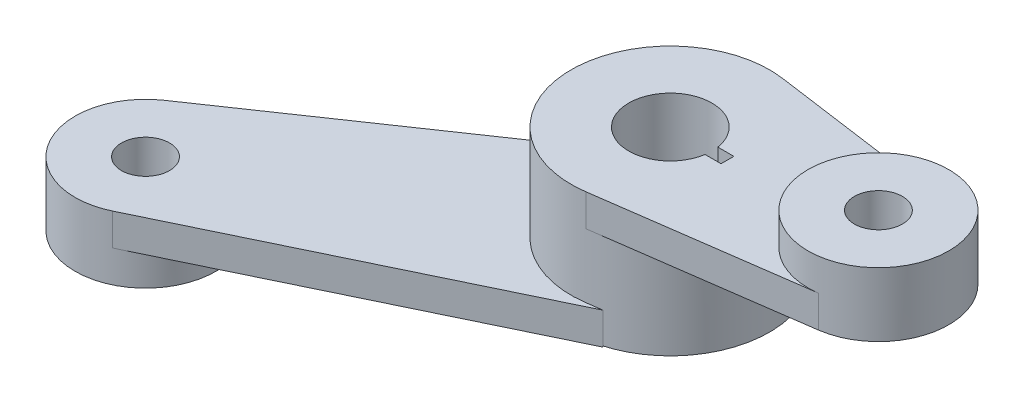
ISO-10303-21;
HEADER;
FILE_DESCRIPTION(('STEP AP214'),'2;1');
FILE_NAME('part.step','',(''),(''),'','','');
FILE_SCHEMA(('AUTOMOTIVE_DESIGN { 1 0 10303 214 1 1 1 1 }'));
ENDSEC;
DATA;
#1=APPLICATION_CONTEXT('core data for automotive mechanical design processes');
#2=APPLICATION_PROTOCOL_DEFINITION('international standard','automotive_design',2000,#1);
#3=PRODUCT_CONTEXT('',#1,'mechanical');
#4=PRODUCT('Part','Part','',(#3));
#5=PRODUCT_RELATED_PRODUCT_CATEGORY('part','',(#4));
#6=PRODUCT_DEFINITION_FORMATION('','',#4);
#7=PRODUCT_DEFINITION_CONTEXT('part definition',#1,'design');
#8=PRODUCT_DEFINITION('design','',#6,#7);
#9=PRODUCT_DEFINITION_SHAPE('','',#8);
#10=(LENGTH_UNIT() NAMED_UNIT(*) SI_UNIT(.MILLI.,.METRE.));
#11=(NAMED_UNIT(*) PLANE_ANGLE_UNIT() SI_UNIT($,.RADIAN.));
#12=(NAMED_UNIT(*) SI_UNIT($,.STERADIAN.) SOLID_ANGLE_UNIT());
#13=UNCERTAINTY_MEASURE_WITH_UNIT(LENGTH_MEASURE(1.E-05),#10,'distance_accuracy_value','');
#14=(GEOMETRIC_REPRESENTATION_CONTEXT(3) GLOBAL_UNCERTAINTY_ASSIGNED_CONTEXT((#13)) GLOBAL_UNIT_ASSIGNED_CONTEXT((#10,
#11,#12)) REPRESENTATION_CONTEXT('',''));
#15=CARTESIAN_POINT('',(0.,0.,0.));
#16=DIRECTION('',(0.,0.,1.));
#17=DIRECTION('',(1.,0.,0.));
#18=AXIS2_PLACEMENT_3D('',#15,#16,#17);
#19=CARTESIAN_POINT('',(0.,40.,0.));
#20=DIRECTION('',(0.,-1.,0.));
#21=DIRECTION('',(0.,0.,-1.));
#22=AXIS2_PLACEMENT_3D('',#19,#20,#21);
#23=CYLINDRICAL_SURFACE('',#22,31.);
#24=DIRECTION('',(0.,-1.,0.));
#25=VECTOR('',#24,1.);
#26=CARTESIAN_POINT('',(4.29230769230769,40.,30.7014021613762));
#27=LINE('',#26,#25);
#28=CARTESIAN_POINT('',(4.29230769230769,40.,30.7014021613762));
#29=VERTEX_POINT('',#28);
#30=CARTESIAN_POINT('',(4.29230769230769,30.,30.7014021613762));
#31=VERTEX_POINT('',#30);
#32=EDGE_CURVE('E212',#29,#31,#27,.T.);
#33=ORIENTED_EDGE('',*,*,#32,.F.);
#34=CARTESIAN_POINT('',(0.,40.,0.));
#35=DIRECTION('',(0.,1.,0.));
#36=DIRECTION('',(0.,0.,1.));
#37=AXIS2_PLACEMENT_3D('',#34,#35,#36);
#38=CIRCLE('',#37,31.);
#39=CARTESIAN_POINT('',(4.29230769230769,40.,-30.7014021613762));
#40=VERTEX_POINT('',#39);
#41=EDGE_CURVE('E231',#40,#29,#38,.T.);
#42=ORIENTED_EDGE('',*,*,#41,.F.);
#43=DIRECTION('',(0.,-1.,0.));
#44=VECTOR('',#43,1.);
#45=CARTESIAN_POINT('',(4.29230769230769,40.,-30.7014021613762));
#46=LINE('',#45,#44);
#47=CARTESIAN_POINT('',(4.29230769230769,30.,-30.7014021613762));
#48=VERTEX_POINT('',#47);
#49=EDGE_CURVE('E216',#40,#48,#46,.T.);
#50=ORIENTED_EDGE('',*,*,#49,.T.);
#51=CARTESIAN_POINT('',(0.,30.,0.));
#52=DIRECTION('',(0.,1.,0.));
#53=DIRECTION('',(0.,0.,1.));
#54=AXIS2_PLACEMENT_3D('',#51,#52,#53);
#55=CIRCLE('',#54,31.);
#56=EDGE_CURVE('E63',#31,#48,#55,.T.);
#57=ORIENTED_EDGE('',*,*,#56,.F.);
#58=EDGE_LOOP('',(#33,#42,#50,#57));
#59=FACE_BOUND('',#58,.T.);
#60=DIRECTION('',(0.,-1.,0.));
#61=VECTOR('',#60,1.);
#62=CARTESIAN_POINT('',(-17.4698538370627,10.,-25.6086744465946));
#63=LINE('',#62,#61);
#64=CARTESIAN_POINT('',(-17.4698538370627,10.,-25.6086744465946));
#65=VERTEX_POINT('',#64);
#66=CARTESIAN_POINT('',(-17.4698538370627,0.,-25.6086744465946));
#67=VERTEX_POINT('',#66);
#68=EDGE_CURVE('E178',#65,#67,#63,.T.);
#69=ORIENTED_EDGE('',*,*,#68,.F.);
#70=CARTESIAN_POINT('',(0.,10.,0.));
#71=DIRECTION('',(0.,1.,0.));
#72=DIRECTION('',(0.,0.,1.));
#73=AXIS2_PLACEMENT_3D('',#70,#71,#72);
#74=CIRCLE('',#73,31.);
#75=CARTESIAN_POINT('',(4.29230769230769,10.,30.7014021613762));
#76=VERTEX_POINT('',#75);
#77=EDGE_CURVE('E161',#65,#76,#74,.T.);
#78=ORIENTED_EDGE('',*,*,#77,.T.);
#79=DIRECTION('',(0.,-1.,0.));
#80=VECTOR('',#79,1.);
#81=CARTESIAN_POINT('',(4.29230769230769,10.,30.7014021613762));
#82=LINE('',#81,#80);
#83=CARTESIAN_POINT('',(4.29230769230769,0.,30.7014021613762));
#84=VERTEX_POINT('',#83);
#85=EDGE_CURVE('E182',#76,#84,#82,.T.);
#86=ORIENTED_EDGE('',*,*,#85,.T.);
#87=CARTESIAN_POINT('',(0.,0.,0.));
#88=DIRECTION('',(0.,1.,0.));
#89=DIRECTION('',(0.,0.,1.));
#90=AXIS2_PLACEMENT_3D('',#87,#88,#89);
#91=CIRCLE('',#90,31.);
#92=EDGE_CURVE('E223',#84,#67,#91,.T.);
#93=ORIENTED_EDGE('',*,*,#92,.T.);
#94=EDGE_LOOP('',(#69,#78,#86,#93));
#95=FACE_BOUND('',#94,.T.);
#96=ADVANCED_FACE('F41',(#59,#95),#23,.T.);
#97=CARTESIAN_POINT('',(0.,40.,0.));
#98=DIRECTION('',(0.,-1.,0.));
#99=DIRECTION('',(0.,0.,-1.));
#100=AXIS2_PLACEMENT_3D('',#97,#98,#99);
#101=CYLINDRICAL_SURFACE('',#100,13.);
#102=CARTESIAN_POINT('',(0.,0.,0.));
#103=DIRECTION('',(0.,1.,0.));
#104=DIRECTION('',(0.,0.,1.));
#105=AXIS2_PLACEMENT_3D('',#102,#103,#104);
#106=CIRCLE('',#105,13.);
#107=CARTESIAN_POINT('',(12.8452325786651,0.,-2.));
#108=VERTEX_POINT('',#107);
#109=CARTESIAN_POINT('',(12.8452325786651,0.,2.));
#110=VERTEX_POINT('',#109);
#111=EDGE_CURVE('E219',#108,#110,#106,.T.);
#112=ORIENTED_EDGE('',*,*,#111,.F.);
#113=DIRECTION('',(0.,-1.,0.));
#114=VECTOR('',#113,1.);
#115=CARTESIAN_POINT('',(12.8452325786651,40.,-2.));
#116=LINE('',#115,#114);
#117=CARTESIAN_POINT('',(12.8452325786651,40.,-2.));
#118=VERTEX_POINT('',#117);
#119=EDGE_CURVE('E11',#118,#108,#116,.T.);
#120=ORIENTED_EDGE('',*,*,#119,.F.);
#121=CARTESIAN_POINT('',(0.,40.,0.));
#122=DIRECTION('',(0.,1.,0.));
#123=DIRECTION('',(0.,0.,1.));
#124=AXIS2_PLACEMENT_3D('',#121,#122,#123);
#125=CIRCLE('',#124,13.);
#126=CARTESIAN_POINT('',(12.8452325786651,40.,2.));
#127=VERTEX_POINT('',#126);
#128=EDGE_CURVE('E222',#118,#127,#125,.T.);
#129=ORIENTED_EDGE('',*,*,#128,.T.);
#130=DIRECTION('',(0.,-1.,0.));
#131=VECTOR('',#130,1.);
#132=CARTESIAN_POINT('',(12.8452325786651,40.,2.));
#133=LINE('',#132,#131);
#134=EDGE_CURVE('E233',#127,#110,#133,.T.);
#135=ORIENTED_EDGE('',*,*,#134,.T.);
#136=EDGE_LOOP('',(#112,#120,#129,#135));
#137=FACE_BOUND('',#136,.T.);
#138=ADVANCED_FACE('F43',(#137),#101,.F.);
#139=CARTESIAN_POINT('',(0.,40.,-2.));
#140=DIRECTION('',(0.,0.,-1.));
#141=DIRECTION('',(-1.,0.,0.));
#142=AXIS2_PLACEMENT_3D('',#139,#140,#141);
#143=PLANE('',#142);
#144=DIRECTION('',(1.,0.,0.));
#145=VECTOR('',#144,1.);
#146=CARTESIAN_POINT('',(0.,0.,-2.));
#147=LINE('',#146,#145);
#148=CARTESIAN_POINT('',(17.8452325786651,0.,-2.));
#149=VERTEX_POINT('',#148);
#150=EDGE_CURVE('E240',#108,#149,#147,.T.);
#151=ORIENTED_EDGE('',*,*,#150,.T.);
#152=DIRECTION('',(0.,-1.,0.));
#153=VECTOR('',#152,1.);
#154=CARTESIAN_POINT('',(17.8452325786651,40.,-2.));
#155=LINE('',#154,#153);
#156=CARTESIAN_POINT('',(17.8452325786651,40.,-2.));
#157=VERTEX_POINT('',#156);
#158=EDGE_CURVE('E47',#157,#149,#155,.T.);
#159=ORIENTED_EDGE('',*,*,#158,.F.);
#160=DIRECTION('',(1.,0.,0.));
#161=VECTOR('',#160,1.);
#162=CARTESIAN_POINT('',(0.,40.,-2.));
#163=LINE('',#162,#161);
#164=EDGE_CURVE('E221',#118,#157,#163,.T.);
#165=ORIENTED_EDGE('',*,*,#164,.F.);
#166=ORIENTED_EDGE('',*,*,#119,.T.);
#167=EDGE_LOOP('',(#151,#159,#165,#166));
#168=FACE_BOUND('',#167,.T.);
#169=ADVANCED_FACE('F275',(#168),#143,.F.);
#170=CARTESIAN_POINT('',(17.8452325786651,40.,0.));
#171=DIRECTION('',(1.,0.,0.));
#172=DIRECTION('',(0.,0.,-1.));
#173=AXIS2_PLACEMENT_3D('',#170,#171,#172);
#174=PLANE('',#173);
#175=DIRECTION('',(0.,0.,1.));
#176=VECTOR('',#175,1.);
#177=CARTESIAN_POINT('',(17.8452325786651,0.,0.));
#178=LINE('',#177,#176);
#179=CARTESIAN_POINT('',(17.8452325786651,0.,2.));
#180=VERTEX_POINT('',#179);
#181=EDGE_CURVE('E239',#149,#180,#178,.T.);
#182=ORIENTED_EDGE('',*,*,#181,.T.);
#183=DIRECTION('',(0.,-1.,0.));
#184=VECTOR('',#183,1.);
#185=CARTESIAN_POINT('',(17.8452325786651,40.,2.));
#186=LINE('',#185,#184);
#187=CARTESIAN_POINT('',(17.8452325786651,40.,2.));
#188=VERTEX_POINT('',#187);
#189=EDGE_CURVE('E250',#188,#180,#186,.T.);
#190=ORIENTED_EDGE('',*,*,#189,.F.);
#191=DIRECTION('',(0.,0.,1.));
#192=VECTOR('',#191,1.);
#193=CARTESIAN_POINT('',(17.8452325786651,40.,0.));
#194=LINE('',#193,#192);
#195=EDGE_CURVE('E230',#157,#188,#194,.T.);
#196=ORIENTED_EDGE('',*,*,#195,.F.);
#197=ORIENTED_EDGE('',*,*,#158,.T.);
#198=EDGE_LOOP('',(#182,#190,#196,#197));
#199=FACE_BOUND('',#198,.T.);
#200=ADVANCED_FACE('F255',(#199),#174,.F.);
#201=CARTESIAN_POINT('',(0.,40.,2.));
#202=DIRECTION('',(0.,0.,1.));
#203=DIRECTION('',(1.,0.,0.));
#204=AXIS2_PLACEMENT_3D('',#201,#202,#203);
#205=PLANE('',#204);
#206=DIRECTION('',(-1.,0.,0.));
#207=VECTOR('',#206,1.);
#208=CARTESIAN_POINT('',(0.,0.,2.));
#209=LINE('',#208,#207);
#210=EDGE_CURVE('E241',#180,#110,#209,.T.);
#211=ORIENTED_EDGE('',*,*,#210,.T.);
#212=ORIENTED_EDGE('',*,*,#134,.F.);
#213=DIRECTION('',(-1.,0.,0.));
#214=VECTOR('',#213,1.);
#215=CARTESIAN_POINT('',(0.,40.,2.));
#216=LINE('',#215,#214);
#217=EDGE_CURVE('E228',#188,#127,#216,.T.);
#218=ORIENTED_EDGE('',*,*,#217,.F.);
#219=ORIENTED_EDGE('',*,*,#189,.T.);
#220=EDGE_LOOP('',(#211,#212,#218,#219));
#221=FACE_BOUND('',#220,.T.);
#222=ADVANCED_FACE('F266',(#221),#205,.F.);
#223=CARTESIAN_POINT('',(0.,40.,0.));
#224=DIRECTION('',(0.,1.,0.));
#225=DIRECTION('',(0.,0.,1.));
#226=AXIS2_PLACEMENT_3D('',#223,#224,#225);
#227=PLANE('',#226);
#228=ORIENTED_EDGE('',*,*,#128,.F.);
#229=ORIENTED_EDGE('',*,*,#164,.T.);
#230=ORIENTED_EDGE('',*,*,#195,.T.);
#231=ORIENTED_EDGE('',*,*,#217,.T.);
#232=EDGE_LOOP('',(#228,#229,#230,#231));
#233=FACE_BOUND('',#232,.T.);
#234=ORIENTED_EDGE('',*,*,#41,.T.);
#235=DIRECTION('',(0.990367811657297,0.,-0.138461538461538));
#236=VECTOR('',#235,1.);
#237=CARTESIAN_POINT('',(4.29230769230769,40.,30.7014021613762));
#238=LINE('',#237,#236);
#239=CARTESIAN_POINT('',(68.0461538461538,40.,21.7880918564605));
#240=VERTEX_POINT('',#239);
#241=EDGE_CURVE('E204',#29,#240,#238,.T.);
#242=ORIENTED_EDGE('',*,*,#241,.T.);
#243=CARTESIAN_POINT('',(65.,40.,0.));
#244=DIRECTION('',(0.,1.,0.));
#245=DIRECTION('',(0.,0.,1.));
#246=AXIS2_PLACEMENT_3D('',#243,#244,#245);
#247=CIRCLE('',#246,22.);
#248=CARTESIAN_POINT('',(68.0461538461539,40.,-21.7880918564605));
#249=VERTEX_POINT('',#248);
#250=EDGE_CURVE('E197',#249,#240,#247,.T.);
#251=ORIENTED_EDGE('',*,*,#250,.F.);
#252=DIRECTION('',(-0.990367811657297,0.,-0.138461538461538));
#253=VECTOR('',#252,1.);
#254=CARTESIAN_POINT('',(4.29230769230769,40.,-30.7014021613762));
#255=LINE('',#254,#253);
#256=EDGE_CURVE('E199',#249,#40,#255,.T.);
#257=ORIENTED_EDGE('',*,*,#256,.T.);
#258=EDGE_LOOP('',(#234,#242,#251,#257));
#259=FACE_BOUND('',#258,.T.);
#260=ADVANCED_FACE('F269',(#233,#259),#227,.T.);
#261=CARTESIAN_POINT('',(0.,0.,0.));
#262=DIRECTION('',(0.,1.,0.));
#263=DIRECTION('',(0.,0.,1.));
#264=AXIS2_PLACEMENT_3D('',#261,#262,#263);
#265=PLANE('',#264);
#266=ORIENTED_EDGE('',*,*,#111,.T.);
#267=ORIENTED_EDGE('',*,*,#210,.F.);
#268=ORIENTED_EDGE('',*,*,#181,.F.);
#269=ORIENTED_EDGE('',*,*,#150,.F.);
#270=EDGE_LOOP('',(#266,#267,#268,#269));
#271=FACE_BOUND('',#270,.T.);
#272=ORIENTED_EDGE('',*,*,#92,.F.);
#273=DIRECTION('',(0.990367811657297,0.,-0.138461538461538));
#274=VECTOR('',#273,1.);
#275=CARTESIAN_POINT('',(4.29230769230769,0.,30.7014021613762));
#276=LINE('',#275,#274);
#277=CARTESIAN_POINT('',(9.08353603028689,0.,30.0315491643498));
#278=VERTEX_POINT('',#277);
#279=EDGE_CURVE('E163',#84,#278,#276,.T.);
#280=ORIENTED_EDGE('',*,*,#279,.T.);
#281=DIRECTION('',(-0.901086272470793,0.,0.433639861595647));
#282=VECTOR('',#281,1.);
#283=CARTESIAN_POINT('',(13.4428357094651,0.,27.9336744465946));
#284=LINE('',#283,#282);
#285=CARTESIAN_POINT('',(-94.3829714990283,0.,79.8238979943576));
#286=VERTEX_POINT('',#285);
#287=EDGE_CURVE('E172',#278,#286,#284,.T.);
#288=ORIENTED_EDGE('',*,*,#287,.T.);
#289=CARTESIAN_POINT('',(-103.923048454133,0.,60.0000000000002));
#290=DIRECTION('',(0.,1.,0.));
#291=DIRECTION('',(0.,0.,1.));
#292=AXIS2_PLACEMENT_3D('',#289,#290,#291);
#293=CIRCLE('',#292,22.);
#294=CARTESIAN_POINT('',(-116.321009241725,0.,41.8261020056427));
#295=VERTEX_POINT('',#294);
#296=EDGE_CURVE('E142',#286,#295,#293,.T.);
#297=ORIENTED_EDGE('',*,*,#296,.T.);
#298=DIRECTION('',(-0.826086272470793,0.,0.563543672163312));
#299=VECTOR('',#298,1.);
#300=CARTESIAN_POINT('',(-17.4698538370627,0.,-25.6086744465946));
#301=LINE('',#300,#299);
#302=EDGE_CURVE('E157',#67,#295,#301,.T.);
#303=ORIENTED_EDGE('',*,*,#302,.F.);
#304=EDGE_LOOP('',(#272,#280,#288,#297,#303));
#305=FACE_BOUND('',#304,.T.);
#306=ADVANCED_FACE('F261',(#271,#305),#265,.F.);
#307=CARTESIAN_POINT('',(4.29230769230769,40.,-30.7014021613762));
#308=DIRECTION('',(-0.138461538461538,0.,0.990367811657297));
#309=DIRECTION('',(0.990367811657297,0.,0.138461538461538));
#310=AXIS2_PLACEMENT_3D('',#307,#308,#309);
#311=PLANE('',#310);
#312=DIRECTION('',(-0.990367811657297,0.,-0.138461538461538));
#313=VECTOR('',#312,1.);
#314=CARTESIAN_POINT('',(4.29230769230769,30.,-30.7014021613762));
#315=LINE('',#314,#313);
#316=CARTESIAN_POINT('',(68.0461538461539,30.,-21.7880918564605));
#317=VERTEX_POINT('',#316);
#318=EDGE_CURVE('E195',#317,#48,#315,.T.);
#319=ORIENTED_EDGE('',*,*,#318,.T.);
#320=ORIENTED_EDGE('',*,*,#49,.F.);
#321=ORIENTED_EDGE('',*,*,#256,.F.);
#322=DIRECTION('',(0.,-1.,0.));
#323=VECTOR('',#322,1.);
#324=CARTESIAN_POINT('',(68.0461538461539,40.,-21.7880918564605));
#325=LINE('',#324,#323);
#326=EDGE_CURVE('E217',#249,#317,#325,.T.);
#327=ORIENTED_EDGE('',*,*,#326,.T.);
#328=EDGE_LOOP('',(#319,#320,#321,#327));
#329=FACE_BOUND('',#328,.T.);
#330=ADVANCED_FACE('F311',(#329),#311,.F.);
#331=CARTESIAN_POINT('',(4.29230769230769,40.,30.7014021613762));
#332=DIRECTION('',(-0.138461538461538,0.,-0.990367811657297));
#333=DIRECTION('',(-0.990367811657297,0.,0.138461538461538));
#334=AXIS2_PLACEMENT_3D('',#331,#332,#333);
#335=PLANE('',#334);
#336=DIRECTION('',(0.990367811657297,0.,-0.138461538461538));
#337=VECTOR('',#336,1.);
#338=CARTESIAN_POINT('',(4.29230769230769,30.,30.7014021613762));
#339=LINE('',#338,#337);
#340=CARTESIAN_POINT('',(68.0461538461539,30.,21.7880918564605));
#341=VERTEX_POINT('',#340);
#342=EDGE_CURVE('E203',#31,#341,#339,.T.);
#343=ORIENTED_EDGE('',*,*,#342,.T.);
#344=DIRECTION('',(0.,-1.,0.));
#345=VECTOR('',#344,1.);
#346=CARTESIAN_POINT('',(68.0461538461539,40.,21.7880918564605));
#347=LINE('',#346,#345);
#348=EDGE_CURVE('E210',#240,#341,#347,.T.);
#349=ORIENTED_EDGE('',*,*,#348,.F.);
#350=ORIENTED_EDGE('',*,*,#241,.F.);
#351=ORIENTED_EDGE('',*,*,#32,.T.);
#352=EDGE_LOOP('',(#343,#349,#350,#351));
#353=FACE_BOUND('',#352,.T.);
#354=ADVANCED_FACE('F316',(#353),#335,.F.);
#355=CARTESIAN_POINT('',(0.,30.,0.));
#356=DIRECTION('',(0.,1.,0.));
#357=DIRECTION('',(0.,0.,1.));
#358=AXIS2_PLACEMENT_3D('',#355,#356,#357);
#359=PLANE('',#358);
#360=ORIENTED_EDGE('',*,*,#318,.F.);
#361=CARTESIAN_POINT('',(65.,30.,0.));
#362=DIRECTION('',(0.,1.,0.));
#363=DIRECTION('',(0.,0.,1.));
#364=AXIS2_PLACEMENT_3D('',#361,#362,#363);
#365=CIRCLE('',#364,22.);
#366=EDGE_CURVE('E188',#341,#317,#365,.T.);
#367=ORIENTED_EDGE('',*,*,#366,.F.);
#368=ORIENTED_EDGE('',*,*,#342,.F.);
#369=ORIENTED_EDGE('',*,*,#56,.T.);
#370=EDGE_LOOP('',(#360,#367,#368,#369));
#371=FACE_BOUND('',#370,.T.);
#372=CARTESIAN_POINT('',(65.,30.,0.));
#373=DIRECTION('',(0.,1.,0.));
#374=DIRECTION('',(0.,0.,1.));
#375=AXIS2_PLACEMENT_3D('',#372,#373,#374);
#376=CIRCLE('',#375,7.50000000000001);
#377=CARTESIAN_POINT('',(65.,30.,7.50000000000001));
#378=VERTEX_POINT('',#377);
#379=EDGE_CURVE('E150',#378,#378,#376,.T.);
#380=ORIENTED_EDGE('',*,*,#379,.T.);
#381=EDGE_LOOP('',(#380));
#382=FACE_BOUND('',#381,.T.);
#383=ADVANCED_FACE('F324',(#371,#382),#359,.F.);
#384=CARTESIAN_POINT('',(65.,50.,0.));
#385=DIRECTION('',(0.,-1.,0.));
#386=DIRECTION('',(0.,0.,-1.));
#387=AXIS2_PLACEMENT_3D('',#384,#385,#386);
#388=CYLINDRICAL_SURFACE('',#387,7.50000000000001);
#389=CARTESIAN_POINT('',(65.,50.,0.));
#390=DIRECTION('',(0.,1.,0.));
#391=DIRECTION('',(0.,0.,1.));
#392=AXIS2_PLACEMENT_3D('',#389,#390,#391);
#393=CIRCLE('',#392,7.50000000000001);
#394=CARTESIAN_POINT('',(65.,50.,7.50000000000001));
#395=VERTEX_POINT('',#394);
#396=EDGE_CURVE('E183',#395,#395,#393,.T.);
#397=ORIENTED_EDGE('',*,*,#396,.T.);
#398=EDGE_LOOP('',(#397));
#399=FACE_BOUND('',#398,.T.);
#400=ORIENTED_EDGE('',*,*,#379,.F.);
#401=EDGE_LOOP('',(#400));
#402=FACE_BOUND('',#401,.T.);
#403=ADVANCED_FACE('F333',(#399,#402),#388,.F.);
#404=CARTESIAN_POINT('',(65.,50.,0.));
#405=DIRECTION('',(0.,-1.,0.));
#406=DIRECTION('',(0.,0.,-1.));
#407=AXIS2_PLACEMENT_3D('',#404,#405,#406);
#408=CYLINDRICAL_SURFACE('',#407,22.);
#409=ORIENTED_EDGE('',*,*,#326,.F.);
#410=ORIENTED_EDGE('',*,*,#250,.T.);
#411=ORIENTED_EDGE('',*,*,#348,.T.);
#412=ORIENTED_EDGE('',*,*,#366,.T.);
#413=EDGE_LOOP('',(#409,#410,#411,#412));
#414=FACE_BOUND('',#413,.T.);
#415=CARTESIAN_POINT('',(65.,50.,0.));
#416=DIRECTION('',(0.,1.,0.));
#417=DIRECTION('',(0.,0.,1.));
#418=AXIS2_PLACEMENT_3D('',#415,#416,#417);
#419=CIRCLE('',#418,22.);
#420=CARTESIAN_POINT('',(65.,50.,22.));
#421=VERTEX_POINT('',#420);
#422=EDGE_CURVE('E187',#421,#421,#419,.T.);
#423=ORIENTED_EDGE('',*,*,#422,.F.);
#424=EDGE_LOOP('',(#423));
#425=FACE_BOUND('',#424,.T.);
#426=ADVANCED_FACE('F342',(#414,#425),#408,.T.);
#427=CARTESIAN_POINT('',(0.,50.,0.));
#428=DIRECTION('',(0.,1.,0.));
#429=DIRECTION('',(0.,0.,1.));
#430=AXIS2_PLACEMENT_3D('',#427,#428,#429);
#431=PLANE('',#430);
#432=ORIENTED_EDGE('',*,*,#396,.F.);
#433=EDGE_LOOP('',(#432));
#434=FACE_BOUND('',#433,.T.);
#435=ORIENTED_EDGE('',*,*,#422,.T.);
#436=EDGE_LOOP('',(#435));
#437=FACE_BOUND('',#436,.T.);
#438=ADVANCED_FACE('F351',(#434,#437),#431,.T.);
#439=CARTESIAN_POINT('',(13.4428357094651,10.,27.9336744465946));
#440=DIRECTION('',(0.433639861595647,0.,0.901086272470793));
#441=DIRECTION('',(0.901086272470793,0.,-0.433639861595647));
#442=AXIS2_PLACEMENT_3D('',#439,#440,#441);
#443=PLANE('',#442);
#444=ORIENTED_EDGE('',*,*,#287,.F.);
#445=DIRECTION('',(0.,-1.,0.));
#446=VECTOR('',#445,1.);
#447=CARTESIAN_POINT('',(9.08353603028689,10.,30.0315491643498));
#448=LINE('',#447,#446);
#449=CARTESIAN_POINT('',(9.08353603028689,10.,30.0315491643498));
#450=VERTEX_POINT('',#449);
#451=EDGE_CURVE('E146',#450,#278,#448,.T.);
#452=ORIENTED_EDGE('',*,*,#451,.F.);
#453=DIRECTION('',(-0.901086272470793,0.,0.433639861595647));
#454=VECTOR('',#453,1.);
#455=CARTESIAN_POINT('',(13.4428357094651,10.,27.9336744465946));
#456=LINE('',#455,#454);
#457=CARTESIAN_POINT('',(-94.3829714990283,10.,79.8238979943576));
#458=VERTEX_POINT('',#457);
#459=EDGE_CURVE('E155',#450,#458,#456,.T.);
#460=ORIENTED_EDGE('',*,*,#459,.T.);
#461=DIRECTION('',(0.,-1.,0.));
#462=VECTOR('',#461,1.);
#463=CARTESIAN_POINT('',(-94.3829714990283,10.,79.8238979943576));
#464=LINE('',#463,#462);
#465=EDGE_CURVE('E136',#458,#286,#464,.T.);
#466=ORIENTED_EDGE('',*,*,#465,.T.);
#467=EDGE_LOOP('',(#444,#452,#460,#466));
#468=FACE_BOUND('',#467,.T.);
#469=ADVANCED_FACE('F158',(#468),#443,.T.);
#470=CARTESIAN_POINT('',(4.29230769230769,10.,30.7014021613762));
#471=DIRECTION('',(-0.138461538461538,0.,-0.990367811657297));
#472=DIRECTION('',(-0.990367811657297,0.,0.138461538461538));
#473=AXIS2_PLACEMENT_3D('',#470,#471,#472);
#474=PLANE('',#473);
#475=ORIENTED_EDGE('',*,*,#279,.F.);
#476=ORIENTED_EDGE('',*,*,#85,.F.);
#477=DIRECTION('',(0.990367811657297,0.,-0.138461538461538));
#478=VECTOR('',#477,1.);
#479=CARTESIAN_POINT('',(4.29230769230769,10.,30.7014021613762));
#480=LINE('',#479,#478);
#481=EDGE_CURVE('E57',#76,#450,#480,.T.);
#482=ORIENTED_EDGE('',*,*,#481,.T.);
#483=ORIENTED_EDGE('',*,*,#451,.T.);
#484=EDGE_LOOP('',(#475,#476,#482,#483));
#485=FACE_BOUND('',#484,.T.);
#486=ADVANCED_FACE('F382',(#485),#474,.T.);
#487=CARTESIAN_POINT('',(-17.4698538370627,10.,-25.6086744465946));
#488=DIRECTION('',(0.563543672163312,0.,0.826086272470793));
#489=DIRECTION('',(0.826086272470793,0.,-0.563543672163312));
#490=AXIS2_PLACEMENT_3D('',#487,#488,#489);
#491=PLANE('',#490);
#492=ORIENTED_EDGE('',*,*,#302,.T.);
#493=DIRECTION('',(0.,-1.,0.));
#494=VECTOR('',#493,1.);
#495=CARTESIAN_POINT('',(-116.321009241725,10.,41.8261020056427));
#496=LINE('',#495,#494);
#497=CARTESIAN_POINT('',(-116.321009241725,10.,41.8261020056427));
#498=VERTEX_POINT('',#497);
#499=EDGE_CURVE('E171',#498,#295,#496,.T.);
#500=ORIENTED_EDGE('',*,*,#499,.F.);
#501=DIRECTION('',(-0.826086272470793,0.,0.563543672163312));
#502=VECTOR('',#501,1.);
#503=CARTESIAN_POINT('',(-17.4698538370627,10.,-25.6086744465946));
#504=LINE('',#503,#502);
#505=EDGE_CURVE('E153',#65,#498,#504,.T.);
#506=ORIENTED_EDGE('',*,*,#505,.F.);
#507=ORIENTED_EDGE('',*,*,#68,.T.);
#508=EDGE_LOOP('',(#492,#500,#506,#507));
#509=FACE_BOUND('',#508,.T.);
#510=ADVANCED_FACE('F395',(#509),#491,.F.);
#511=CARTESIAN_POINT('',(0.,10.,0.));
#512=DIRECTION('',(0.,1.,0.));
#513=DIRECTION('',(0.,0.,1.));
#514=AXIS2_PLACEMENT_3D('',#511,#512,#513);
#515=PLANE('',#514);
#516=ORIENTED_EDGE('',*,*,#505,.T.);
#517=CARTESIAN_POINT('',(-103.923048454133,10.,60.0000000000002));
#518=DIRECTION('',(0.,1.,0.));
#519=DIRECTION('',(0.,0.,1.));
#520=AXIS2_PLACEMENT_3D('',#517,#518,#519);
#521=CIRCLE('',#520,22.);
#522=EDGE_CURVE('E138',#498,#458,#521,.T.);
#523=ORIENTED_EDGE('',*,*,#522,.T.);
#524=ORIENTED_EDGE('',*,*,#459,.F.);
#525=ORIENTED_EDGE('',*,*,#481,.F.);
#526=ORIENTED_EDGE('',*,*,#77,.F.);
#527=EDGE_LOOP('',(#516,#523,#524,#525,#526));
#528=FACE_BOUND('',#527,.T.);
#529=CARTESIAN_POINT('',(-103.923048454133,10.,60.0000000000002));
#530=DIRECTION('',(0.,1.,0.));
#531=DIRECTION('',(0.,0.,1.));
#532=AXIS2_PLACEMENT_3D('',#529,#530,#531);
#533=CIRCLE('',#532,7.50000000000002);
#534=CARTESIAN_POINT('',(-103.923048454133,10.,67.5000000000002));
#535=VERTEX_POINT('',#534);
#536=EDGE_CURVE('E156',#535,#535,#533,.T.);
#537=ORIENTED_EDGE('',*,*,#536,.F.);
#538=EDGE_LOOP('',(#537));
#539=FACE_BOUND('',#538,.T.);
#540=ADVANCED_FACE('F147',(#528,#539),#515,.T.);
#541=CARTESIAN_POINT('',(-103.923048454133,-10.,60.0000000000002));
#542=DIRECTION('',(0.,1.,0.));
#543=DIRECTION('',(0.,0.,1.));
#544=AXIS2_PLACEMENT_3D('',#541,#542,#543);
#545=CYLINDRICAL_SURFACE('',#544,22.);
#546=CARTESIAN_POINT('',(-103.923048454133,-10.,60.0000000000002));
#547=DIRECTION('',(0.,1.,0.));
#548=DIRECTION('',(0.,0.,1.));
#549=AXIS2_PLACEMENT_3D('',#546,#547,#548);
#550=CIRCLE('',#549,22.);
#551=CARTESIAN_POINT('',(-103.923048454133,-10.,82.0000000000002));
#552=VERTEX_POINT('',#551);
#553=EDGE_CURVE('E173',#552,#552,#550,.T.);
#554=ORIENTED_EDGE('',*,*,#553,.T.);
#555=EDGE_LOOP('',(#554));
#556=FACE_BOUND('',#555,.T.);
#557=ORIENTED_EDGE('',*,*,#465,.F.);
#558=ORIENTED_EDGE('',*,*,#522,.F.);
#559=ORIENTED_EDGE('',*,*,#499,.T.);
#560=ORIENTED_EDGE('',*,*,#296,.F.);
#561=EDGE_LOOP('',(#557,#558,#559,#560));
#562=FACE_BOUND('',#561,.T.);
#563=ADVANCED_FACE('F137',(#556,#562),#545,.T.);
#564=CARTESIAN_POINT('',(-103.923048454133,-10.,60.0000000000002));
#565=DIRECTION('',(0.,1.,0.));
#566=DIRECTION('',(0.,0.,1.));
#567=AXIS2_PLACEMENT_3D('',#564,#565,#566);
#568=CYLINDRICAL_SURFACE('',#567,7.50000000000002);
#569=CARTESIAN_POINT('',(-103.923048454133,-10.,60.0000000000002));
#570=DIRECTION('',(0.,1.,0.));
#571=DIRECTION('',(0.,0.,1.));
#572=AXIS2_PLACEMENT_3D('',#569,#570,#571);
#573=CIRCLE('',#572,7.50000000000002);
#574=CARTESIAN_POINT('',(-103.923048454133,-10.,67.5000000000002));
#575=VERTEX_POINT('',#574);
#576=EDGE_CURVE('E154',#575,#575,#573,.T.);
#577=ORIENTED_EDGE('',*,*,#576,.F.);
#578=EDGE_LOOP('',(#577));
#579=FACE_BOUND('',#578,.T.);
#580=ORIENTED_EDGE('',*,*,#536,.T.);
#581=EDGE_LOOP('',(#580));
#582=FACE_BOUND('',#581,.T.);
#583=ADVANCED_FACE('F423',(#579,#582),#568,.F.);
#584=CARTESIAN_POINT('',(0.,-10.,0.));
#585=DIRECTION('',(0.,1.,0.));
#586=DIRECTION('',(0.,0.,1.));
#587=AXIS2_PLACEMENT_3D('',#584,#585,#586);
#588=PLANE('',#587);
#589=ORIENTED_EDGE('',*,*,#576,.T.);
#590=EDGE_LOOP('',(#589));
#591=FACE_BOUND('',#590,.T.);
#592=ORIENTED_EDGE('',*,*,#553,.F.);
#593=EDGE_LOOP('',(#592));
#594=FACE_BOUND('',#593,.T.);
#595=ADVANCED_FACE('F431',(#591,#594),#588,.F.);
#596=CLOSED_SHELL('',(#96,#138,#169,#200,#222,#260,#306,#330,#354,#383,#403,#426,#438,#469,#486,
#510,#540,#563,#583,#595));
#597=MANIFOLD_SOLID_BREP('B2',#596);
#598=ADVANCED_BREP_SHAPE_REPRESENTATION('',(#18,#597),#14);
#599=SHAPE_DEFINITION_REPRESENTATION(#9,#598);
ENDSEC;
END-ISO-10303-21;
